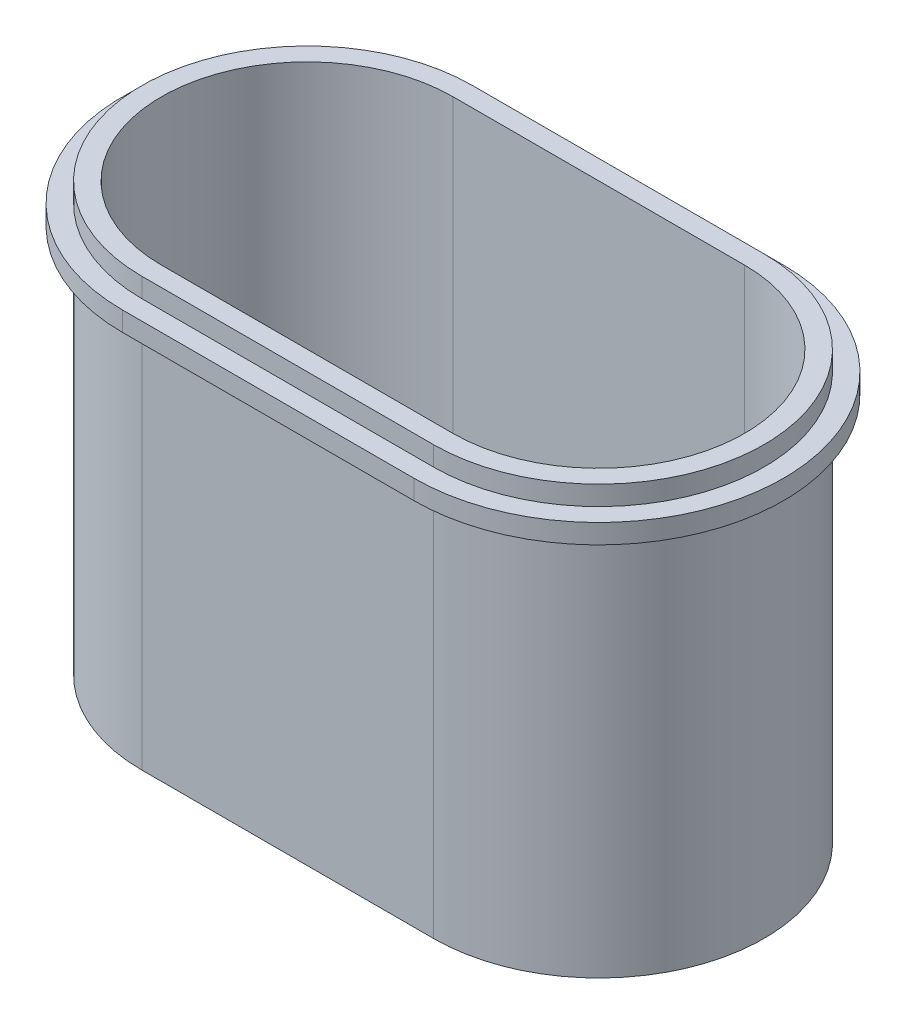
ISO-10303-21;
HEADER;
FILE_DESCRIPTION(('STEP AP214'),'2;1');
FILE_NAME('part.step','',(''),(''),'','','');
FILE_SCHEMA(('AUTOMOTIVE_DESIGN { 1 0 10303 214 1 1 1 1 }'));
ENDSEC;
DATA;
#1=APPLICATION_CONTEXT('core data for automotive mechanical design processes');
#2=APPLICATION_PROTOCOL_DEFINITION('international standard','automotive_design',2000,#1);
#3=PRODUCT_CONTEXT('',#1,'mechanical');
#4=PRODUCT('Part','Part','',(#3));
#5=PRODUCT_RELATED_PRODUCT_CATEGORY('part','',(#4));
#6=PRODUCT_DEFINITION_FORMATION('','',#4);
#7=PRODUCT_DEFINITION_CONTEXT('part definition',#1,'design');
#8=PRODUCT_DEFINITION('design','',#6,#7);
#9=PRODUCT_DEFINITION_SHAPE('','',#8);
#10=(LENGTH_UNIT() NAMED_UNIT(*) SI_UNIT(.MILLI.,.METRE.));
#11=(NAMED_UNIT(*) PLANE_ANGLE_UNIT() SI_UNIT($,.RADIAN.));
#12=(NAMED_UNIT(*) SI_UNIT($,.STERADIAN.) SOLID_ANGLE_UNIT());
#13=UNCERTAINTY_MEASURE_WITH_UNIT(LENGTH_MEASURE(1.E-05),#10,'distance_accuracy_value','');
#14=(GEOMETRIC_REPRESENTATION_CONTEXT(3) GLOBAL_UNCERTAINTY_ASSIGNED_CONTEXT((#13)) GLOBAL_UNIT_ASSIGNED_CONTEXT((#10,
#11,#12)) REPRESENTATION_CONTEXT('',''));
#15=CARTESIAN_POINT('',(0.,0.,0.));
#16=DIRECTION('',(0.,0.,1.));
#17=DIRECTION('',(1.,0.,0.));
#18=AXIS2_PLACEMENT_3D('',#15,#16,#17);
#19=CARTESIAN_POINT('',(75.,0.,0.));
#20=DIRECTION('',(0.,1.,0.));
#21=DIRECTION('',(0.,0.,1.));
#22=AXIS2_PLACEMENT_3D('',#19,#20,#21);
#23=PLANE('',#22);
#24=CARTESIAN_POINT('',(75.,0.,0.));
#25=DIRECTION('',(0.,1.,0.));
#26=DIRECTION('',(0.,0.,1.));
#27=AXIS2_PLACEMENT_3D('',#24,#25,#26);
#28=CIRCLE('',#27,95.);
#29=CARTESIAN_POINT('',(75.,0.,95.));
#30=VERTEX_POINT('',#29);
#31=CARTESIAN_POINT('',(75.,0.,-95.));
#32=VERTEX_POINT('',#31);
#33=EDGE_CURVE('E291',#30,#32,#28,.T.);
#34=ORIENTED_EDGE('',*,*,#33,.F.);
#35=DIRECTION('',(1.,0.,0.));
#36=VECTOR('',#35,1.);
#37=CARTESIAN_POINT('',(-75.,0.,95.));
#38=LINE('',#37,#36);
#39=CARTESIAN_POINT('',(-75.,0.,95.));
#40=VERTEX_POINT('',#39);
#41=EDGE_CURVE('E297',#40,#30,#38,.T.);
#42=ORIENTED_EDGE('',*,*,#41,.F.);
#43=CARTESIAN_POINT('',(-75.,0.,0.));
#44=DIRECTION('',(0.,1.,0.));
#45=DIRECTION('',(0.,0.,1.));
#46=AXIS2_PLACEMENT_3D('',#43,#44,#45);
#47=CIRCLE('',#46,95.);
#48=CARTESIAN_POINT('',(-75.,0.,-95.));
#49=VERTEX_POINT('',#48);
#50=EDGE_CURVE('E313',#49,#40,#47,.T.);
#51=ORIENTED_EDGE('',*,*,#50,.F.);
#52=DIRECTION('',(-1.,0.,0.));
#53=VECTOR('',#52,1.);
#54=CARTESIAN_POINT('',(-75.,0.,-95.));
#55=LINE('',#54,#53);
#56=EDGE_CURVE('E310',#32,#49,#55,.T.);
#57=ORIENTED_EDGE('',*,*,#56,.F.);
#58=EDGE_LOOP('',(#34,#42,#51,#57));
#59=FACE_BOUND('',#58,.T.);
#60=CARTESIAN_POINT('',(-75.,0.,0.));
#61=DIRECTION('',(0.,-1.,0.));
#62=DIRECTION('',(0.,0.,-1.));
#63=AXIS2_PLACEMENT_3D('',#60,#61,#62);
#64=CIRCLE('',#63,85.);
#65=CARTESIAN_POINT('',(-75.,0.,85.));
#66=VERTEX_POINT('',#65);
#67=CARTESIAN_POINT('',(-75.,0.,-85.));
#68=VERTEX_POINT('',#67);
#69=EDGE_CURVE('E196',#66,#68,#64,.T.);
#70=ORIENTED_EDGE('',*,*,#69,.F.);
#71=DIRECTION('',(-1.,0.,0.));
#72=VECTOR('',#71,1.);
#73=CARTESIAN_POINT('',(75.,0.,85.));
#74=LINE('',#73,#72);
#75=CARTESIAN_POINT('',(75.,0.,85.));
#76=VERTEX_POINT('',#75);
#77=EDGE_CURVE('E207',#76,#66,#74,.T.);
#78=ORIENTED_EDGE('',*,*,#77,.F.);
#79=CARTESIAN_POINT('',(75.,0.,0.));
#80=DIRECTION('',(0.,-1.,0.));
#81=DIRECTION('',(0.,0.,-1.));
#82=AXIS2_PLACEMENT_3D('',#79,#80,#81);
#83=CIRCLE('',#82,85.);
#84=CARTESIAN_POINT('',(75.,0.,-85.));
#85=VERTEX_POINT('',#84);
#86=EDGE_CURVE('E224',#85,#76,#83,.T.);
#87=ORIENTED_EDGE('',*,*,#86,.F.);
#88=DIRECTION('',(1.,0.,0.));
#89=VECTOR('',#88,1.);
#90=CARTESIAN_POINT('',(-75.,0.,-85.));
#91=LINE('',#90,#89);
#92=EDGE_CURVE('E220',#68,#85,#91,.T.);
#93=ORIENTED_EDGE('',*,*,#92,.F.);
#94=EDGE_LOOP('',(#70,#78,#87,#93));
#95=FACE_BOUND('',#94,.T.);
#96=ADVANCED_FACE('F39',(#59,#95),#23,.F.);
#97=CARTESIAN_POINT('',(75.,10.,0.));
#98=DIRECTION('',(0.,-1.,0.));
#99=DIRECTION('',(0.,0.,-1.));
#100=AXIS2_PLACEMENT_3D('',#97,#98,#99);
#101=CYLINDRICAL_SURFACE('',#100,95.);
#102=ORIENTED_EDGE('',*,*,#33,.T.);
#103=DIRECTION('',(0.,-1.,0.));
#104=VECTOR('',#103,1.);
#105=CARTESIAN_POINT('',(75.,10.,-95.));
#106=LINE('',#105,#104);
#107=CARTESIAN_POINT('',(75.,10.,-95.));
#108=VERTEX_POINT('',#107);
#109=EDGE_CURVE('E11',#108,#32,#106,.T.);
#110=ORIENTED_EDGE('',*,*,#109,.F.);
#111=CARTESIAN_POINT('',(75.,10.,0.));
#112=DIRECTION('',(0.,1.,0.));
#113=DIRECTION('',(0.,0.,1.));
#114=AXIS2_PLACEMENT_3D('',#111,#112,#113);
#115=CIRCLE('',#114,95.);
#116=CARTESIAN_POINT('',(75.,10.,95.));
#117=VERTEX_POINT('',#116);
#118=EDGE_CURVE('E292',#117,#108,#115,.T.);
#119=ORIENTED_EDGE('',*,*,#118,.F.);
#120=DIRECTION('',(0.,-1.,0.));
#121=VECTOR('',#120,1.);
#122=CARTESIAN_POINT('',(75.,10.,95.));
#123=LINE('',#122,#121);
#124=EDGE_CURVE('E306',#117,#30,#123,.T.);
#125=ORIENTED_EDGE('',*,*,#124,.T.);
#126=EDGE_LOOP('',(#102,#110,#119,#125));
#127=FACE_BOUND('',#126,.T.);
#128=ADVANCED_FACE('F41',(#127),#101,.T.);
#129=CARTESIAN_POINT('',(-75.,10.,-95.));
#130=DIRECTION('',(0.,0.,1.));
#131=DIRECTION('',(1.,0.,0.));
#132=AXIS2_PLACEMENT_3D('',#129,#130,#131);
#133=PLANE('',#132);
#134=ORIENTED_EDGE('',*,*,#56,.T.);
#135=DIRECTION('',(0.,-1.,0.));
#136=VECTOR('',#135,1.);
#137=CARTESIAN_POINT('',(-75.,10.,-95.));
#138=LINE('',#137,#136);
#139=CARTESIAN_POINT('',(-75.,10.,-95.));
#140=VERTEX_POINT('',#139);
#141=EDGE_CURVE('E48',#140,#49,#138,.T.);
#142=ORIENTED_EDGE('',*,*,#141,.F.);
#143=DIRECTION('',(-1.,0.,0.));
#144=VECTOR('',#143,1.);
#145=CARTESIAN_POINT('',(-75.,10.,-95.));
#146=LINE('',#145,#144);
#147=EDGE_CURVE('E296',#108,#140,#146,.T.);
#148=ORIENTED_EDGE('',*,*,#147,.F.);
#149=ORIENTED_EDGE('',*,*,#109,.T.);
#150=EDGE_LOOP('',(#134,#142,#148,#149));
#151=FACE_BOUND('',#150,.T.);
#152=ADVANCED_FACE('F346',(#151),#133,.F.);
#153=CARTESIAN_POINT('',(-75.,10.,0.));
#154=DIRECTION('',(0.,-1.,0.));
#155=DIRECTION('',(0.,0.,-1.));
#156=AXIS2_PLACEMENT_3D('',#153,#154,#155);
#157=CYLINDRICAL_SURFACE('',#156,95.);
#158=ORIENTED_EDGE('',*,*,#50,.T.);
#159=DIRECTION('',(0.,-1.,0.));
#160=VECTOR('',#159,1.);
#161=CARTESIAN_POINT('',(-75.,10.,95.));
#162=LINE('',#161,#160);
#163=CARTESIAN_POINT('',(-75.,10.,95.));
#164=VERTEX_POINT('',#163);
#165=EDGE_CURVE('E321',#164,#40,#162,.T.);
#166=ORIENTED_EDGE('',*,*,#165,.F.);
#167=CARTESIAN_POINT('',(-75.,10.,0.));
#168=DIRECTION('',(0.,1.,0.));
#169=DIRECTION('',(0.,0.,1.));
#170=AXIS2_PLACEMENT_3D('',#167,#168,#169);
#171=CIRCLE('',#170,95.);
#172=EDGE_CURVE('E300',#140,#164,#171,.T.);
#173=ORIENTED_EDGE('',*,*,#172,.F.);
#174=ORIENTED_EDGE('',*,*,#141,.T.);
#175=EDGE_LOOP('',(#158,#166,#173,#174));
#176=FACE_BOUND('',#175,.T.);
#177=ADVANCED_FACE('F330',(#176),#157,.T.);
#178=CARTESIAN_POINT('',(-75.,10.,95.));
#179=DIRECTION('',(0.,0.,-1.));
#180=DIRECTION('',(-1.,0.,0.));
#181=AXIS2_PLACEMENT_3D('',#178,#179,#180);
#182=PLANE('',#181);
#183=ORIENTED_EDGE('',*,*,#41,.T.);
#184=ORIENTED_EDGE('',*,*,#124,.F.);
#185=DIRECTION('',(1.,0.,0.));
#186=VECTOR('',#185,1.);
#187=CARTESIAN_POINT('',(-75.,10.,95.));
#188=LINE('',#187,#186);
#189=EDGE_CURVE('E303',#164,#117,#188,.T.);
#190=ORIENTED_EDGE('',*,*,#189,.F.);
#191=ORIENTED_EDGE('',*,*,#165,.T.);
#192=EDGE_LOOP('',(#183,#184,#190,#191));
#193=FACE_BOUND('',#192,.T.);
#194=ADVANCED_FACE('F339',(#193),#182,.F.);
#195=CARTESIAN_POINT('',(75.,10.,0.));
#196=DIRECTION('',(0.,1.,0.));
#197=DIRECTION('',(0.,0.,1.));
#198=AXIS2_PLACEMENT_3D('',#195,#196,#197);
#199=PLANE('',#198);
#200=CARTESIAN_POINT('',(75.,10.,0.));
#201=DIRECTION('',(0.,1.,0.));
#202=DIRECTION('',(0.,0.,1.));
#203=AXIS2_PLACEMENT_3D('',#200,#201,#202);
#204=CIRCLE('',#203,85.);
#205=CARTESIAN_POINT('',(75.,10.,85.));
#206=VERTEX_POINT('',#205);
#207=CARTESIAN_POINT('',(75.,10.,-85.));
#208=VERTEX_POINT('',#207);
#209=EDGE_CURVE('E246',#206,#208,#204,.T.);
#210=ORIENTED_EDGE('',*,*,#209,.F.);
#211=DIRECTION('',(1.,0.,0.));
#212=VECTOR('',#211,1.);
#213=CARTESIAN_POINT('',(-75.,10.,85.));
#214=LINE('',#213,#212);
#215=CARTESIAN_POINT('',(-75.,10.,85.));
#216=VERTEX_POINT('',#215);
#217=EDGE_CURVE('E252',#216,#206,#214,.T.);
#218=ORIENTED_EDGE('',*,*,#217,.F.);
#219=CARTESIAN_POINT('',(-75.,10.,0.));
#220=DIRECTION('',(0.,1.,0.));
#221=DIRECTION('',(0.,0.,1.));
#222=AXIS2_PLACEMENT_3D('',#219,#220,#221);
#223=CIRCLE('',#222,85.);
#224=CARTESIAN_POINT('',(-75.,10.,-85.));
#225=VERTEX_POINT('',#224);
#226=EDGE_CURVE('E269',#225,#216,#223,.T.);
#227=ORIENTED_EDGE('',*,*,#226,.F.);
#228=DIRECTION('',(-1.,0.,0.));
#229=VECTOR('',#228,1.);
#230=CARTESIAN_POINT('',(-75.,10.,-85.));
#231=LINE('',#230,#229);
#232=EDGE_CURVE('E265',#208,#225,#231,.T.);
#233=ORIENTED_EDGE('',*,*,#232,.F.);
#234=EDGE_LOOP('',(#210,#218,#227,#233));
#235=FACE_BOUND('',#234,.T.);
#236=ORIENTED_EDGE('',*,*,#118,.T.);
#237=ORIENTED_EDGE('',*,*,#147,.T.);
#238=ORIENTED_EDGE('',*,*,#172,.T.);
#239=ORIENTED_EDGE('',*,*,#189,.T.);
#240=EDGE_LOOP('',(#236,#237,#238,#239));
#241=FACE_BOUND('',#240,.T.);
#242=ADVANCED_FACE('F345',(#235,#241),#199,.T.);
#243=CARTESIAN_POINT('',(75.,20.,0.));
#244=DIRECTION('',(0.,-1.,0.));
#245=DIRECTION('',(0.,0.,-1.));
#246=AXIS2_PLACEMENT_3D('',#243,#244,#245);
#247=CYLINDRICAL_SURFACE('',#246,85.);
#248=ORIENTED_EDGE('',*,*,#209,.T.);
#249=DIRECTION('',(0.,-1.,0.));
#250=VECTOR('',#249,1.);
#251=CARTESIAN_POINT('',(75.,20.,-85.));
#252=LINE('',#251,#250);
#253=CARTESIAN_POINT('',(75.,20.,-85.));
#254=VERTEX_POINT('',#253);
#255=EDGE_CURVE('E287',#254,#208,#252,.T.);
#256=ORIENTED_EDGE('',*,*,#255,.F.);
#257=CARTESIAN_POINT('',(75.,20.,0.));
#258=DIRECTION('',(0.,1.,0.));
#259=DIRECTION('',(0.,0.,1.));
#260=AXIS2_PLACEMENT_3D('',#257,#258,#259);
#261=CIRCLE('',#260,85.);
#262=CARTESIAN_POINT('',(75.,20.,85.));
#263=VERTEX_POINT('',#262);
#264=EDGE_CURVE('E247',#263,#254,#261,.T.);
#265=ORIENTED_EDGE('',*,*,#264,.F.);
#266=DIRECTION('',(0.,-1.,0.));
#267=VECTOR('',#266,1.);
#268=CARTESIAN_POINT('',(75.,20.,85.));
#269=LINE('',#268,#267);
#270=EDGE_CURVE('E261',#263,#206,#269,.T.);
#271=ORIENTED_EDGE('',*,*,#270,.T.);
#272=EDGE_LOOP('',(#248,#256,#265,#271));
#273=FACE_BOUND('',#272,.T.);
#274=ADVANCED_FACE('F364',(#273),#247,.T.);
#275=CARTESIAN_POINT('',(-75.,20.,-85.));
#276=DIRECTION('',(0.,0.,1.));
#277=DIRECTION('',(1.,0.,0.));
#278=AXIS2_PLACEMENT_3D('',#275,#276,#277);
#279=PLANE('',#278);
#280=ORIENTED_EDGE('',*,*,#232,.T.);
#281=DIRECTION('',(0.,-1.,0.));
#282=VECTOR('',#281,1.);
#283=CARTESIAN_POINT('',(-75.,20.,-85.));
#284=LINE('',#283,#282);
#285=CARTESIAN_POINT('',(-75.,20.,-85.));
#286=VERTEX_POINT('',#285);
#287=EDGE_CURVE('E283',#286,#225,#284,.T.);
#288=ORIENTED_EDGE('',*,*,#287,.F.);
#289=DIRECTION('',(-1.,0.,0.));
#290=VECTOR('',#289,1.);
#291=CARTESIAN_POINT('',(-75.,20.,-85.));
#292=LINE('',#291,#290);
#293=EDGE_CURVE('E251',#254,#286,#292,.T.);
#294=ORIENTED_EDGE('',*,*,#293,.F.);
#295=ORIENTED_EDGE('',*,*,#255,.T.);
#296=EDGE_LOOP('',(#280,#288,#294,#295));
#297=FACE_BOUND('',#296,.T.);
#298=ADVANCED_FACE('F369',(#297),#279,.F.);
#299=CARTESIAN_POINT('',(-75.,20.,0.));
#300=DIRECTION('',(0.,-1.,0.));
#301=DIRECTION('',(0.,0.,-1.));
#302=AXIS2_PLACEMENT_3D('',#299,#300,#301);
#303=CYLINDRICAL_SURFACE('',#302,85.);
#304=ORIENTED_EDGE('',*,*,#226,.T.);
#305=DIRECTION('',(0.,-1.,0.));
#306=VECTOR('',#305,1.);
#307=CARTESIAN_POINT('',(-75.,20.,85.));
#308=LINE('',#307,#306);
#309=CARTESIAN_POINT('',(-75.,20.,85.));
#310=VERTEX_POINT('',#309);
#311=EDGE_CURVE('E279',#310,#216,#308,.T.);
#312=ORIENTED_EDGE('',*,*,#311,.F.);
#313=CARTESIAN_POINT('',(-75.,20.,0.));
#314=DIRECTION('',(0.,1.,0.));
#315=DIRECTION('',(0.,0.,1.));
#316=AXIS2_PLACEMENT_3D('',#313,#314,#315);
#317=CIRCLE('',#316,85.);
#318=EDGE_CURVE('E255',#286,#310,#317,.T.);
#319=ORIENTED_EDGE('',*,*,#318,.F.);
#320=ORIENTED_EDGE('',*,*,#287,.T.);
#321=EDGE_LOOP('',(#304,#312,#319,#320));
#322=FACE_BOUND('',#321,.T.);
#323=ADVANCED_FACE('F383',(#322),#303,.T.);
#324=CARTESIAN_POINT('',(-75.,20.,85.));
#325=DIRECTION('',(0.,0.,-1.));
#326=DIRECTION('',(-1.,0.,0.));
#327=AXIS2_PLACEMENT_3D('',#324,#325,#326);
#328=PLANE('',#327);
#329=ORIENTED_EDGE('',*,*,#217,.T.);
#330=ORIENTED_EDGE('',*,*,#270,.F.);
#331=DIRECTION('',(1.,0.,0.));
#332=VECTOR('',#331,1.);
#333=CARTESIAN_POINT('',(-75.,20.,85.));
#334=LINE('',#333,#332);
#335=EDGE_CURVE('E258',#310,#263,#334,.T.);
#336=ORIENTED_EDGE('',*,*,#335,.F.);
#337=ORIENTED_EDGE('',*,*,#311,.T.);
#338=EDGE_LOOP('',(#329,#330,#336,#337));
#339=FACE_BOUND('',#338,.T.);
#340=ADVANCED_FACE('F374',(#339),#328,.F.);
#341=CARTESIAN_POINT('',(75.,20.,0.));
#342=DIRECTION('',(0.,1.,0.));
#343=DIRECTION('',(0.,0.,1.));
#344=AXIS2_PLACEMENT_3D('',#341,#342,#343);
#345=PLANE('',#344);
#346=CARTESIAN_POINT('',(75.,20.,0.));
#347=DIRECTION('',(0.,1.,0.));
#348=DIRECTION('',(0.,0.,1.));
#349=AXIS2_PLACEMENT_3D('',#346,#347,#348);
#350=CIRCLE('',#349,75.);
#351=CARTESIAN_POINT('',(75.,20.,75.));
#352=VERTEX_POINT('',#351);
#353=CARTESIAN_POINT('',(75.,20.,-75.));
#354=VERTEX_POINT('',#353);
#355=EDGE_CURVE('E55',#352,#354,#350,.T.);
#356=ORIENTED_EDGE('',*,*,#355,.F.);
#357=DIRECTION('',(1.,0.,0.));
#358=VECTOR('',#357,1.);
#359=CARTESIAN_POINT('',(-75.,20.,75.));
#360=LINE('',#359,#358);
#361=CARTESIAN_POINT('',(-75.,20.,75.));
#362=VERTEX_POINT('',#361);
#363=EDGE_CURVE('E174',#362,#352,#360,.T.);
#364=ORIENTED_EDGE('',*,*,#363,.F.);
#365=CARTESIAN_POINT('',(-75.,20.,0.));
#366=DIRECTION('',(0.,1.,0.));
#367=DIRECTION('',(0.,0.,1.));
#368=AXIS2_PLACEMENT_3D('',#365,#366,#367);
#369=CIRCLE('',#368,75.);
#370=CARTESIAN_POINT('',(-75.,20.,-75.));
#371=VERTEX_POINT('',#370);
#372=EDGE_CURVE('E178',#371,#362,#369,.T.);
#373=ORIENTED_EDGE('',*,*,#372,.F.);
#374=DIRECTION('',(-1.,0.,0.));
#375=VECTOR('',#374,1.);
#376=CARTESIAN_POINT('',(-75.,20.,-75.));
#377=LINE('',#376,#375);
#378=EDGE_CURVE('E187',#354,#371,#377,.T.);
#379=ORIENTED_EDGE('',*,*,#378,.F.);
#380=EDGE_LOOP('',(#356,#364,#373,#379));
#381=FACE_BOUND('',#380,.T.);
#382=ORIENTED_EDGE('',*,*,#264,.T.);
#383=ORIENTED_EDGE('',*,*,#293,.T.);
#384=ORIENTED_EDGE('',*,*,#318,.T.);
#385=ORIENTED_EDGE('',*,*,#335,.T.);
#386=EDGE_LOOP('',(#382,#383,#384,#385));
#387=FACE_BOUND('',#386,.T.);
#388=ADVANCED_FACE('F379',(#381,#387),#345,.T.);
#389=CARTESIAN_POINT('',(-75.,-200.,0.));
#390=DIRECTION('',(0.,1.,0.));
#391=DIRECTION('',(0.,0.,1.));
#392=AXIS2_PLACEMENT_3D('',#389,#390,#391);
#393=CYLINDRICAL_SURFACE('',#392,85.);
#394=ORIENTED_EDGE('',*,*,#69,.T.);
#395=DIRECTION('',(0.,1.,0.));
#396=VECTOR('',#395,1.);
#397=CARTESIAN_POINT('',(-75.,-200.,-85.));
#398=LINE('',#397,#396);
#399=CARTESIAN_POINT('',(-75.,-200.,-85.));
#400=VERTEX_POINT('',#399);
#401=EDGE_CURVE('E242',#400,#68,#398,.T.);
#402=ORIENTED_EDGE('',*,*,#401,.F.);
#403=CARTESIAN_POINT('',(-75.,-200.,0.));
#404=DIRECTION('',(0.,-1.,0.));
#405=DIRECTION('',(0.,0.,-1.));
#406=AXIS2_PLACEMENT_3D('',#403,#404,#405);
#407=CIRCLE('',#406,85.);
#408=CARTESIAN_POINT('',(-75.,-200.,85.));
#409=VERTEX_POINT('',#408);
#410=EDGE_CURVE('E202',#409,#400,#407,.T.);
#411=ORIENTED_EDGE('',*,*,#410,.F.);
#412=DIRECTION('',(0.,1.,0.));
#413=VECTOR('',#412,1.);
#414=CARTESIAN_POINT('',(-75.,-200.,85.));
#415=LINE('',#414,#413);
#416=EDGE_CURVE('E216',#409,#66,#415,.T.);
#417=ORIENTED_EDGE('',*,*,#416,.T.);
#418=EDGE_LOOP('',(#394,#402,#411,#417));
#419=FACE_BOUND('',#418,.T.);
#420=ADVANCED_FACE('F396',(#419),#393,.T.);
#421=CARTESIAN_POINT('',(-75.,-200.,-85.));
#422=DIRECTION('',(0.,0.,1.));
#423=DIRECTION('',(1.,0.,0.));
#424=AXIS2_PLACEMENT_3D('',#421,#422,#423);
#425=PLANE('',#424);
#426=ORIENTED_EDGE('',*,*,#92,.T.);
#427=DIRECTION('',(0.,1.,0.));
#428=VECTOR('',#427,1.);
#429=CARTESIAN_POINT('',(75.,-200.,-85.));
#430=LINE('',#429,#428);
#431=CARTESIAN_POINT('',(75.,-200.,-85.));
#432=VERTEX_POINT('',#431);
#433=EDGE_CURVE('E238',#432,#85,#430,.T.);
#434=ORIENTED_EDGE('',*,*,#433,.F.);
#435=DIRECTION('',(1.,0.,0.));
#436=VECTOR('',#435,1.);
#437=CARTESIAN_POINT('',(-75.,-200.,-85.));
#438=LINE('',#437,#436);
#439=EDGE_CURVE('E206',#400,#432,#438,.T.);
#440=ORIENTED_EDGE('',*,*,#439,.F.);
#441=ORIENTED_EDGE('',*,*,#401,.T.);
#442=EDGE_LOOP('',(#426,#434,#440,#441));
#443=FACE_BOUND('',#442,.T.);
#444=ADVANCED_FACE('F400',(#443),#425,.F.);
#445=CARTESIAN_POINT('',(75.,-200.,0.));
#446=DIRECTION('',(0.,1.,0.));
#447=DIRECTION('',(0.,0.,1.));
#448=AXIS2_PLACEMENT_3D('',#445,#446,#447);
#449=CYLINDRICAL_SURFACE('',#448,85.);
#450=ORIENTED_EDGE('',*,*,#86,.T.);
#451=DIRECTION('',(0.,1.,0.));
#452=VECTOR('',#451,1.);
#453=CARTESIAN_POINT('',(75.,-200.,85.));
#454=LINE('',#453,#452);
#455=CARTESIAN_POINT('',(75.,-200.,85.));
#456=VERTEX_POINT('',#455);
#457=EDGE_CURVE('E234',#456,#76,#454,.T.);
#458=ORIENTED_EDGE('',*,*,#457,.F.);
#459=CARTESIAN_POINT('',(75.,-200.,0.));
#460=DIRECTION('',(0.,-1.,0.));
#461=DIRECTION('',(0.,0.,-1.));
#462=AXIS2_PLACEMENT_3D('',#459,#460,#461);
#463=CIRCLE('',#462,85.);
#464=EDGE_CURVE('E210',#432,#456,#463,.T.);
#465=ORIENTED_EDGE('',*,*,#464,.F.);
#466=ORIENTED_EDGE('',*,*,#433,.T.);
#467=EDGE_LOOP('',(#450,#458,#465,#466));
#468=FACE_BOUND('',#467,.T.);
#469=ADVANCED_FACE('F404',(#468),#449,.T.);
#470=CARTESIAN_POINT('',(75.,-200.,85.));
#471=DIRECTION('',(0.,0.,-1.));
#472=DIRECTION('',(-1.,0.,0.));
#473=AXIS2_PLACEMENT_3D('',#470,#471,#472);
#474=PLANE('',#473);
#475=ORIENTED_EDGE('',*,*,#77,.T.);
#476=ORIENTED_EDGE('',*,*,#416,.F.);
#477=DIRECTION('',(-1.,0.,0.));
#478=VECTOR('',#477,1.);
#479=CARTESIAN_POINT('',(75.,-200.,85.));
#480=LINE('',#479,#478);
#481=EDGE_CURVE('E213',#456,#409,#480,.T.);
#482=ORIENTED_EDGE('',*,*,#481,.F.);
#483=ORIENTED_EDGE('',*,*,#457,.T.);
#484=EDGE_LOOP('',(#475,#476,#482,#483));
#485=FACE_BOUND('',#484,.T.);
#486=ADVANCED_FACE('F408',(#485),#474,.F.);
#487=CARTESIAN_POINT('',(-75.,-200.,0.));
#488=DIRECTION('',(0.,-1.,0.));
#489=DIRECTION('',(0.,0.,-1.));
#490=AXIS2_PLACEMENT_3D('',#487,#488,#489);
#491=PLANE('',#490);
#492=CARTESIAN_POINT('',(75.,-200.,0.));
#493=DIRECTION('',(0.,1.,0.));
#494=DIRECTION('',(0.,0.,1.));
#495=AXIS2_PLACEMENT_3D('',#492,#493,#494);
#496=CIRCLE('',#495,75.);
#497=CARTESIAN_POINT('',(75.,-200.,75.));
#498=VERTEX_POINT('',#497);
#499=CARTESIAN_POINT('',(75.,-200.,-75.));
#500=VERTEX_POINT('',#499);
#501=EDGE_CURVE('E155',#498,#500,#496,.T.);
#502=ORIENTED_EDGE('',*,*,#501,.T.);
#503=DIRECTION('',(-1.,0.,0.));
#504=VECTOR('',#503,1.);
#505=CARTESIAN_POINT('',(-75.,-200.,-75.));
#506=LINE('',#505,#504);
#507=CARTESIAN_POINT('',(-75.,-200.,-75.));
#508=VERTEX_POINT('',#507);
#509=EDGE_CURVE('E165',#500,#508,#506,.T.);
#510=ORIENTED_EDGE('',*,*,#509,.T.);
#511=CARTESIAN_POINT('',(-75.,-200.,0.));
#512=DIRECTION('',(0.,1.,0.));
#513=DIRECTION('',(0.,0.,1.));
#514=AXIS2_PLACEMENT_3D('',#511,#512,#513);
#515=CIRCLE('',#514,75.);
#516=CARTESIAN_POINT('',(-75.,-200.,75.));
#517=VERTEX_POINT('',#516);
#518=EDGE_CURVE('E63',#508,#517,#515,.T.);
#519=ORIENTED_EDGE('',*,*,#518,.T.);
#520=DIRECTION('',(1.,0.,0.));
#521=VECTOR('',#520,1.);
#522=CARTESIAN_POINT('',(-75.,-200.,75.));
#523=LINE('',#522,#521);
#524=EDGE_CURVE('E162',#517,#498,#523,.T.);
#525=ORIENTED_EDGE('',*,*,#524,.T.);
#526=EDGE_LOOP('',(#502,#510,#519,#525));
#527=FACE_BOUND('',#526,.T.);
#528=ORIENTED_EDGE('',*,*,#410,.T.);
#529=ORIENTED_EDGE('',*,*,#439,.T.);
#530=ORIENTED_EDGE('',*,*,#464,.T.);
#531=ORIENTED_EDGE('',*,*,#481,.T.);
#532=EDGE_LOOP('',(#528,#529,#530,#531));
#533=FACE_BOUND('',#532,.T.);
#534=ADVANCED_FACE('F170',(#527,#533),#491,.T.);
#535=CARTESIAN_POINT('',(75.,-200.,0.));
#536=DIRECTION('',(0.,1.,0.));
#537=DIRECTION('',(0.,0.,1.));
#538=AXIS2_PLACEMENT_3D('',#535,#536,#537);
#539=CYLINDRICAL_SURFACE('',#538,75.);
#540=ORIENTED_EDGE('',*,*,#355,.T.);
#541=DIRECTION('',(0.,1.,0.));
#542=VECTOR('',#541,1.);
#543=CARTESIAN_POINT('',(75.,-200.,-75.));
#544=LINE('',#543,#542);
#545=EDGE_CURVE('E151',#500,#354,#544,.T.);
#546=ORIENTED_EDGE('',*,*,#545,.F.);
#547=ORIENTED_EDGE('',*,*,#501,.F.);
#548=DIRECTION('',(0.,1.,0.));
#549=VECTOR('',#548,1.);
#550=CARTESIAN_POINT('',(75.,-200.,75.));
#551=LINE('',#550,#549);
#552=EDGE_CURVE('E193',#498,#352,#551,.T.);
#553=ORIENTED_EDGE('',*,*,#552,.T.);
#554=EDGE_LOOP('',(#540,#546,#547,#553));
#555=FACE_BOUND('',#554,.T.);
#556=ADVANCED_FACE('F153',(#555),#539,.F.);
#557=CARTESIAN_POINT('',(-75.,-200.,75.));
#558=DIRECTION('',(0.,0.,1.));
#559=DIRECTION('',(1.,0.,0.));
#560=AXIS2_PLACEMENT_3D('',#557,#558,#559);
#561=PLANE('',#560);
#562=ORIENTED_EDGE('',*,*,#363,.T.);
#563=ORIENTED_EDGE('',*,*,#552,.F.);
#564=ORIENTED_EDGE('',*,*,#524,.F.);
#565=DIRECTION('',(0.,1.,0.));
#566=VECTOR('',#565,1.);
#567=CARTESIAN_POINT('',(-75.,-200.,75.));
#568=LINE('',#567,#566);
#569=EDGE_CURVE('E197',#517,#362,#568,.T.);
#570=ORIENTED_EDGE('',*,*,#569,.T.);
#571=EDGE_LOOP('',(#562,#563,#564,#570));
#572=FACE_BOUND('',#571,.T.);
#573=ADVANCED_FACE('F417',(#572),#561,.F.);
#574=CARTESIAN_POINT('',(-75.,-200.,0.));
#575=DIRECTION('',(0.,1.,0.));
#576=DIRECTION('',(0.,0.,1.));
#577=AXIS2_PLACEMENT_3D('',#574,#575,#576);
#578=CYLINDRICAL_SURFACE('',#577,75.);
#579=ORIENTED_EDGE('',*,*,#372,.T.);
#580=ORIENTED_EDGE('',*,*,#569,.F.);
#581=ORIENTED_EDGE('',*,*,#518,.F.);
#582=DIRECTION('',(0.,1.,0.));
#583=VECTOR('',#582,1.);
#584=CARTESIAN_POINT('',(-75.,-200.,-75.));
#585=LINE('',#584,#583);
#586=EDGE_CURVE('E161',#508,#371,#585,.T.);
#587=ORIENTED_EDGE('',*,*,#586,.T.);
#588=EDGE_LOOP('',(#579,#580,#581,#587));
#589=FACE_BOUND('',#588,.T.);
#590=ADVANCED_FACE('F420',(#589),#578,.F.);
#591=CARTESIAN_POINT('',(-75.,-200.,-75.));
#592=DIRECTION('',(0.,0.,-1.));
#593=DIRECTION('',(-1.,0.,0.));
#594=AXIS2_PLACEMENT_3D('',#591,#592,#593);
#595=PLANE('',#594);
#596=ORIENTED_EDGE('',*,*,#378,.T.);
#597=ORIENTED_EDGE('',*,*,#586,.F.);
#598=ORIENTED_EDGE('',*,*,#509,.F.);
#599=ORIENTED_EDGE('',*,*,#545,.T.);
#600=EDGE_LOOP('',(#596,#597,#598,#599));
#601=FACE_BOUND('',#600,.T.);
#602=ADVANCED_FACE('F166',(#601),#595,.F.);
#603=CLOSED_SHELL('',(#96,#128,#152,#177,#194,#242,#274,#298,#323,#340,#388,#420,#444,#469,#486,
#534,#556,#573,#590,#602));
#604=MANIFOLD_SOLID_BREP('B2',#603);
#605=ADVANCED_BREP_SHAPE_REPRESENTATION('',(#18,#604),#14);
#606=SHAPE_DEFINITION_REPRESENTATION(#9,#605);
ENDSEC;
END-ISO-10303-21;
